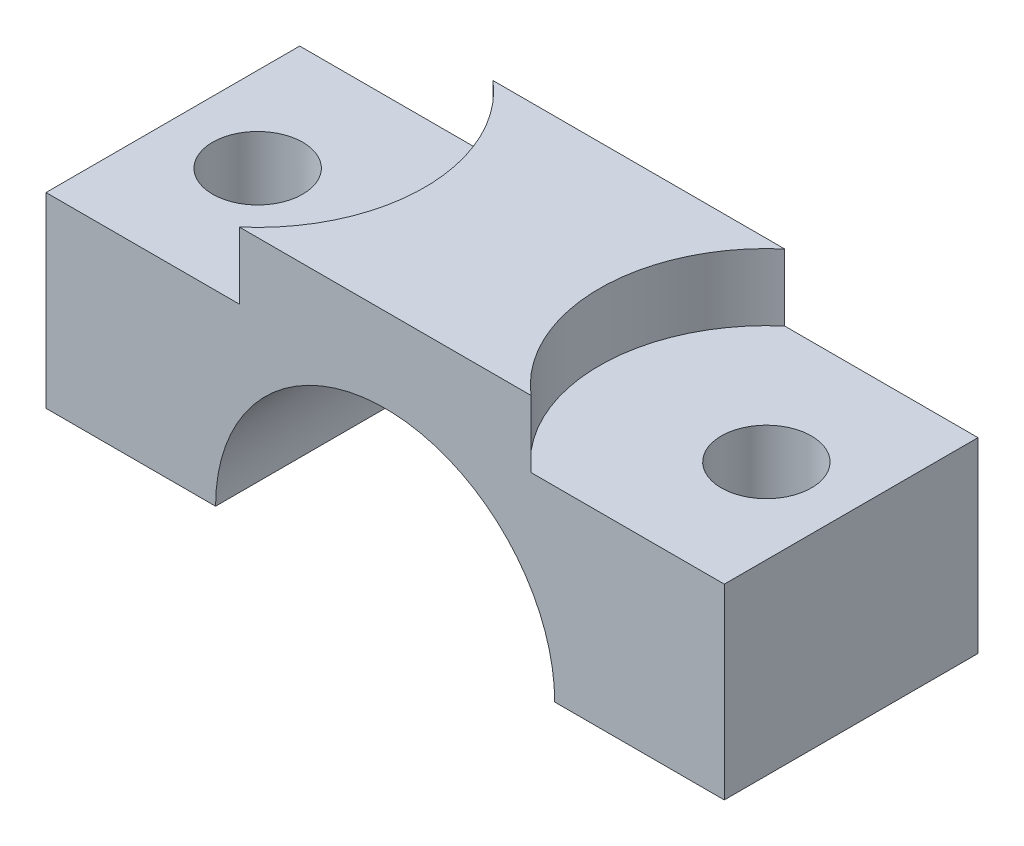
ISO-10303-21;
HEADER;
FILE_DESCRIPTION(('STEP AP214'),'2;1');
FILE_NAME('part.step','',(''),(''),'','','');
FILE_SCHEMA(('AUTOMOTIVE_DESIGN { 1 0 10303 214 1 1 1 1 }'));
ENDSEC;
DATA;
#1=APPLICATION_CONTEXT('core data for automotive mechanical design processes');
#2=APPLICATION_PROTOCOL_DEFINITION('international standard','automotive_design',2000,#1);
#3=PRODUCT_CONTEXT('',#1,'mechanical');
#4=PRODUCT('Part','Part','',(#3));
#5=PRODUCT_RELATED_PRODUCT_CATEGORY('part','',(#4));
#6=PRODUCT_DEFINITION_FORMATION('','',#4);
#7=PRODUCT_DEFINITION_CONTEXT('part definition',#1,'design');
#8=PRODUCT_DEFINITION('design','',#6,#7);
#9=PRODUCT_DEFINITION_SHAPE('','',#8);
#10=(LENGTH_UNIT() NAMED_UNIT(*) SI_UNIT(.MILLI.,.METRE.));
#11=(NAMED_UNIT(*) PLANE_ANGLE_UNIT() SI_UNIT($,.RADIAN.));
#12=(NAMED_UNIT(*) SI_UNIT($,.STERADIAN.) SOLID_ANGLE_UNIT());
#13=UNCERTAINTY_MEASURE_WITH_UNIT(LENGTH_MEASURE(1.E-05),#10,'distance_accuracy_value','');
#14=(GEOMETRIC_REPRESENTATION_CONTEXT(3) GLOBAL_UNCERTAINTY_ASSIGNED_CONTEXT((#13)) GLOBAL_UNIT_ASSIGNED_CONTEXT((#10,
#11,#12)) REPRESENTATION_CONTEXT('',''));
#15=CARTESIAN_POINT('',(0.,0.,0.));
#16=DIRECTION('',(0.,0.,1.));
#17=DIRECTION('',(1.,0.,0.));
#18=AXIS2_PLACEMENT_3D('',#15,#16,#17);
#19=CARTESIAN_POINT('',(0.,19.,9.5));
#20=DIRECTION('',(0.,1.,0.));
#21=DIRECTION('',(0.,0.,1.));
#22=AXIS2_PLACEMENT_3D('',#19,#20,#21);
#23=PLANE('',#22);
#24=CARTESIAN_POINT('',(19.05,19.,0.));
#25=DIRECTION('',(0.,1.,0.));
#26=DIRECTION('',(0.,0.,1.));
#27=AXIS2_PLACEMENT_3D('',#24,#25,#26);
#28=CIRCLE('',#27,12.5);
#29=CARTESIAN_POINT('',(10.925961595364,19.,-9.5));
#30=VERTEX_POINT('',#29);
#31=CARTESIAN_POINT('',(10.925961595364,19.,9.5));
#32=VERTEX_POINT('',#31);
#33=EDGE_CURVE('E151',#30,#32,#28,.T.);
#34=ORIENTED_EDGE('',*,*,#33,.F.);
#35=DIRECTION('',(1.,0.,0.));
#36=VECTOR('',#35,1.);
#37=CARTESIAN_POINT('',(0.,19.,-9.5));
#38=LINE('',#37,#36);
#39=CARTESIAN_POINT('',(-10.925961595364,19.,-9.5));
#40=VERTEX_POINT('',#39);
#41=EDGE_CURVE('E138',#40,#30,#38,.T.);
#42=ORIENTED_EDGE('',*,*,#41,.F.);
#43=CARTESIAN_POINT('',(-19.05,19.,0.));
#44=DIRECTION('',(0.,-1.,0.));
#45=DIRECTION('',(0.,0.,-1.));
#46=AXIS2_PLACEMENT_3D('',#43,#44,#45);
#47=CIRCLE('',#46,12.5);
#48=CARTESIAN_POINT('',(-10.925961595364,19.,9.5));
#49=VERTEX_POINT('',#48);
#50=EDGE_CURVE('E148',#40,#49,#47,.T.);
#51=ORIENTED_EDGE('',*,*,#50,.T.);
#52=DIRECTION('',(1.,0.,0.));
#53=VECTOR('',#52,1.);
#54=CARTESIAN_POINT('',(0.,19.,9.5));
#55=LINE('',#54,#53);
#56=EDGE_CURVE('E180',#49,#32,#55,.T.);
#57=ORIENTED_EDGE('',*,*,#56,.T.);
#58=EDGE_LOOP('',(#34,#42,#51,#57));
#59=FACE_BOUND('',#58,.T.);
#60=ADVANCED_FACE('F41',(#59),#23,.T.);
#61=CARTESIAN_POINT('',(25.4,0.,9.5));
#62=DIRECTION('',(-1.,0.,0.));
#63=DIRECTION('',(0.,0.,1.));
#64=AXIS2_PLACEMENT_3D('',#61,#62,#63);
#65=PLANE('',#64);
#66=DIRECTION('',(0.,0.,-1.));
#67=VECTOR('',#66,1.);
#68=CARTESIAN_POINT('',(25.4,14.,0.));
#69=LINE('',#68,#67);
#70=CARTESIAN_POINT('',(25.4,14.,9.5));
#71=VERTEX_POINT('',#70);
#72=CARTESIAN_POINT('',(25.4,14.,-9.5));
#73=VERTEX_POINT('',#72);
#74=EDGE_CURVE('E65',#71,#73,#69,.T.);
#75=ORIENTED_EDGE('',*,*,#74,.F.);
#76=DIRECTION('',(0.,1.,0.));
#77=VECTOR('',#76,1.);
#78=CARTESIAN_POINT('',(25.4,0.,9.5));
#79=LINE('',#78,#77);
#80=CARTESIAN_POINT('',(25.4,0.,9.5));
#81=VERTEX_POINT('',#80);
#82=EDGE_CURVE('E177',#81,#71,#79,.T.);
#83=ORIENTED_EDGE('',*,*,#82,.F.);
#84=DIRECTION('',(0.,0.,-1.));
#85=VECTOR('',#84,1.);
#86=CARTESIAN_POINT('',(25.4,0.,9.5));
#87=LINE('',#86,#85);
#88=CARTESIAN_POINT('',(25.4,0.,-9.5));
#89=VERTEX_POINT('',#88);
#90=EDGE_CURVE('E199',#81,#89,#87,.T.);
#91=ORIENTED_EDGE('',*,*,#90,.T.);
#92=DIRECTION('',(0.,1.,0.));
#93=VECTOR('',#92,1.);
#94=CARTESIAN_POINT('',(25.4,0.,-9.5));
#95=LINE('',#94,#93);
#96=EDGE_CURVE('E193',#89,#73,#95,.T.);
#97=ORIENTED_EDGE('',*,*,#96,.T.);
#98=EDGE_LOOP('',(#75,#83,#91,#97));
#99=FACE_BOUND('',#98,.T.);
#100=ADVANCED_FACE('F214',(#99),#65,.F.);
#101=CARTESIAN_POINT('',(0.,0.,9.5));
#102=DIRECTION('',(0.,0.,1.));
#103=DIRECTION('',(1.,0.,0.));
#104=AXIS2_PLACEMENT_3D('',#101,#102,#103);
#105=PLANE('',#104);
#106=DIRECTION('',(0.,1.,0.));
#107=VECTOR('',#106,1.);
#108=CARTESIAN_POINT('',(10.925961595364,14.,9.5));
#109=LINE('',#108,#107);
#110=CARTESIAN_POINT('',(10.925961595364,14.,9.5));
#111=VERTEX_POINT('',#110);
#112=EDGE_CURVE('E124',#111,#32,#109,.T.);
#113=ORIENTED_EDGE('',*,*,#112,.T.);
#114=ORIENTED_EDGE('',*,*,#56,.F.);
#115=DIRECTION('',(0.,1.,0.));
#116=VECTOR('',#115,1.);
#117=CARTESIAN_POINT('',(-10.925961595364,14.,9.5));
#118=LINE('',#117,#116);
#119=CARTESIAN_POINT('',(-10.925961595364,14.,9.5));
#120=VERTEX_POINT('',#119);
#121=EDGE_CURVE('E145',#120,#49,#118,.T.);
#122=ORIENTED_EDGE('',*,*,#121,.F.);
#123=DIRECTION('',(-1.,0.,0.));
#124=VECTOR('',#123,1.);
#125=CARTESIAN_POINT('',(-10.925961595364,14.,9.5));
#126=LINE('',#125,#124);
#127=CARTESIAN_POINT('',(-25.4,14.,9.5));
#128=VERTEX_POINT('',#127);
#129=EDGE_CURVE('E155',#120,#128,#126,.T.);
#130=ORIENTED_EDGE('',*,*,#129,.T.);
#131=DIRECTION('',(0.,1.,0.));
#132=VECTOR('',#131,1.);
#133=CARTESIAN_POINT('',(-25.4,0.,9.5));
#134=LINE('',#133,#132);
#135=CARTESIAN_POINT('',(-25.4,0.,9.5));
#136=VERTEX_POINT('',#135);
#137=EDGE_CURVE('E183',#136,#128,#134,.T.);
#138=ORIENTED_EDGE('',*,*,#137,.F.);
#139=DIRECTION('',(-1.,0.,0.));
#140=VECTOR('',#139,1.);
#141=CARTESIAN_POINT('',(0.,0.,9.5));
#142=LINE('',#141,#140);
#143=CARTESIAN_POINT('',(-12.7,0.,9.5));
#144=VERTEX_POINT('',#143);
#145=EDGE_CURVE('E169',#144,#136,#142,.T.);
#146=ORIENTED_EDGE('',*,*,#145,.F.);
#147=CARTESIAN_POINT('',(0.,0.,9.5));
#148=DIRECTION('',(0.,0.,1.));
#149=DIRECTION('',(1.,0.,0.));
#150=AXIS2_PLACEMENT_3D('',#147,#148,#149);
#151=CIRCLE('',#150,12.7);
#152=CARTESIAN_POINT('',(12.7,1.11258151511047E-13,9.5));
#153=VERTEX_POINT('',#152);
#154=EDGE_CURVE('E172',#144,#153,#151,.F.);
#155=ORIENTED_EDGE('',*,*,#154,.T.);
#156=DIRECTION('',(1.,0.,0.));
#157=VECTOR('',#156,1.);
#158=CARTESIAN_POINT('',(0.,0.,9.5));
#159=LINE('',#158,#157);
#160=EDGE_CURVE('E175',#153,#81,#159,.T.);
#161=ORIENTED_EDGE('',*,*,#160,.T.);
#162=ORIENTED_EDGE('',*,*,#82,.T.);
#163=DIRECTION('',(1.,0.,0.));
#164=VECTOR('',#163,1.);
#165=CARTESIAN_POINT('',(0.,14.,9.5));
#166=LINE('',#165,#164);
#167=EDGE_CURVE('E126',#111,#71,#166,.T.);
#168=ORIENTED_EDGE('',*,*,#167,.F.);
#169=EDGE_LOOP('',(#113,#114,#122,#130,#138,#146,#155,#161,#162,#168));
#170=FACE_BOUND('',#169,.T.);
#171=ADVANCED_FACE('F217',(#170),#105,.T.);
#172=CARTESIAN_POINT('',(0.,0.,-9.5));
#173=DIRECTION('',(0.,0.,1.));
#174=DIRECTION('',(1.,0.,0.));
#175=AXIS2_PLACEMENT_3D('',#172,#173,#174);
#176=PLANE('',#175);
#177=ORIENTED_EDGE('',*,*,#41,.T.);
#178=DIRECTION('',(0.,1.,0.));
#179=VECTOR('',#178,1.);
#180=CARTESIAN_POINT('',(10.925961595364,14.,-9.5));
#181=LINE('',#180,#179);
#182=CARTESIAN_POINT('',(10.925961595364,14.,-9.5));
#183=VERTEX_POINT('',#182);
#184=EDGE_CURVE('E121',#183,#30,#181,.T.);
#185=ORIENTED_EDGE('',*,*,#184,.F.);
#186=DIRECTION('',(-1.,0.,0.));
#187=VECTOR('',#186,1.);
#188=CARTESIAN_POINT('',(0.,14.,-9.5));
#189=LINE('',#188,#187);
#190=EDGE_CURVE('E127',#73,#183,#189,.T.);
#191=ORIENTED_EDGE('',*,*,#190,.F.);
#192=ORIENTED_EDGE('',*,*,#96,.F.);
#193=DIRECTION('',(1.,0.,0.));
#194=VECTOR('',#193,1.);
#195=CARTESIAN_POINT('',(0.,0.,-9.5));
#196=LINE('',#195,#194);
#197=CARTESIAN_POINT('',(12.7,1.11258151511047E-13,-9.5));
#198=VERTEX_POINT('',#197);
#199=EDGE_CURVE('E191',#198,#89,#196,.T.);
#200=ORIENTED_EDGE('',*,*,#199,.F.);
#201=CARTESIAN_POINT('',(0.,0.,-9.5));
#202=DIRECTION('',(0.,0.,1.));
#203=DIRECTION('',(1.,0.,0.));
#204=AXIS2_PLACEMENT_3D('',#201,#202,#203);
#205=CIRCLE('',#204,12.7);
#206=CARTESIAN_POINT('',(-12.7,0.,-9.5));
#207=VERTEX_POINT('',#206);
#208=EDGE_CURVE('E189',#207,#198,#205,.F.);
#209=ORIENTED_EDGE('',*,*,#208,.F.);
#210=DIRECTION('',(-1.,0.,0.));
#211=VECTOR('',#210,1.);
#212=CARTESIAN_POINT('',(0.,0.,-9.5));
#213=LINE('',#212,#211);
#214=CARTESIAN_POINT('',(-25.4,0.,-9.5));
#215=VERTEX_POINT('',#214);
#216=EDGE_CURVE('E165',#207,#215,#213,.T.);
#217=ORIENTED_EDGE('',*,*,#216,.T.);
#218=DIRECTION('',(0.,1.,0.));
#219=VECTOR('',#218,1.);
#220=CARTESIAN_POINT('',(-25.4,0.,-9.5));
#221=LINE('',#220,#219);
#222=CARTESIAN_POINT('',(-25.4,14.,-9.5));
#223=VERTEX_POINT('',#222);
#224=EDGE_CURVE('E173',#215,#223,#221,.T.);
#225=ORIENTED_EDGE('',*,*,#224,.T.);
#226=DIRECTION('',(1.,0.,0.));
#227=VECTOR('',#226,1.);
#228=CARTESIAN_POINT('',(-25.4,14.,-9.5));
#229=LINE('',#228,#227);
#230=CARTESIAN_POINT('',(-10.925961595364,14.,-9.5));
#231=VERTEX_POINT('',#230);
#232=EDGE_CURVE('E152',#223,#231,#229,.T.);
#233=ORIENTED_EDGE('',*,*,#232,.T.);
#234=DIRECTION('',(0.,1.,0.));
#235=VECTOR('',#234,1.);
#236=CARTESIAN_POINT('',(-10.925961595364,14.,-9.5));
#237=LINE('',#236,#235);
#238=EDGE_CURVE('E57',#231,#40,#237,.T.);
#239=ORIENTED_EDGE('',*,*,#238,.T.);
#240=EDGE_LOOP('',(#177,#185,#191,#192,#200,#209,#217,#225,#233,#239));
#241=FACE_BOUND('',#240,.T.);
#242=ADVANCED_FACE('F136',(#241),#176,.F.);
#243=CARTESIAN_POINT('',(19.05,0.,0.));
#244=DIRECTION('',(0.,1.,0.));
#245=DIRECTION('',(0.,0.,1.));
#246=AXIS2_PLACEMENT_3D('',#243,#244,#245);
#247=CYLINDRICAL_SURFACE('',#246,3.375);
#248=CARTESIAN_POINT('',(19.05,0.,0.));
#249=DIRECTION('',(0.,1.,0.));
#250=DIRECTION('',(0.,0.,1.));
#251=AXIS2_PLACEMENT_3D('',#248,#249,#250);
#252=CIRCLE('',#251,3.375);
#253=CARTESIAN_POINT('',(19.05,0.,3.375));
#254=VERTEX_POINT('',#253);
#255=EDGE_CURVE('E162',#254,#254,#252,.F.);
#256=ORIENTED_EDGE('',*,*,#255,.T.);
#257=EDGE_LOOP('',(#256));
#258=FACE_BOUND('',#257,.T.);
#259=CARTESIAN_POINT('',(19.05,14.,0.));
#260=DIRECTION('',(0.,1.,0.));
#261=DIRECTION('',(0.,0.,1.));
#262=AXIS2_PLACEMENT_3D('',#259,#260,#261);
#263=CIRCLE('',#262,3.375);
#264=CARTESIAN_POINT('',(19.05,14.,3.375));
#265=VERTEX_POINT('',#264);
#266=EDGE_CURVE('E133',#265,#265,#263,.F.);
#267=ORIENTED_EDGE('',*,*,#266,.F.);
#268=EDGE_LOOP('',(#267));
#269=FACE_BOUND('',#268,.T.);
#270=ADVANCED_FACE('F239',(#258,#269),#247,.F.);
#271=CARTESIAN_POINT('',(0.,0.,9.5));
#272=DIRECTION('',(0.,-1.,0.));
#273=DIRECTION('',(1.,0.,0.));
#274=AXIS2_PLACEMENT_3D('',#271,#272,#273);
#275=PLANE('',#274);
#276=CARTESIAN_POINT('',(-19.05,0.,0.));
#277=DIRECTION('',(0.,1.,0.));
#278=DIRECTION('',(0.,0.,1.));
#279=AXIS2_PLACEMENT_3D('',#276,#277,#278);
#280=CIRCLE('',#279,3.375);
#281=CARTESIAN_POINT('',(-19.05,0.,3.375));
#282=VERTEX_POINT('',#281);
#283=EDGE_CURVE('E166',#282,#282,#280,.T.);
#284=ORIENTED_EDGE('',*,*,#283,.T.);
#285=EDGE_LOOP('',(#284));
#286=FACE_BOUND('',#285,.T.);
#287=ORIENTED_EDGE('',*,*,#216,.F.);
#288=DIRECTION('',(0.,0.,-1.));
#289=VECTOR('',#288,1.);
#290=CARTESIAN_POINT('',(-12.7,0.,9.5));
#291=LINE('',#290,#289);
#292=EDGE_CURVE('E11',#144,#207,#291,.T.);
#293=ORIENTED_EDGE('',*,*,#292,.F.);
#294=ORIENTED_EDGE('',*,*,#145,.T.);
#295=DIRECTION('',(0.,0.,-1.));
#296=VECTOR('',#295,1.);
#297=CARTESIAN_POINT('',(-25.4,0.,9.5));
#298=LINE('',#297,#296);
#299=EDGE_CURVE('E186',#136,#215,#298,.T.);
#300=ORIENTED_EDGE('',*,*,#299,.T.);
#301=EDGE_LOOP('',(#287,#293,#294,#300));
#302=FACE_BOUND('',#301,.T.);
#303=ADVANCED_FACE('F43',(#286,#302),#275,.T.);
#304=CARTESIAN_POINT('',(0.,0.,9.5));
#305=DIRECTION('',(0.,0.,-1.));
#306=DIRECTION('',(-1.,0.,0.));
#307=AXIS2_PLACEMENT_3D('',#304,#305,#306);
#308=CYLINDRICAL_SURFACE('',#307,12.7);
#309=ORIENTED_EDGE('',*,*,#208,.T.);
#310=DIRECTION('',(0.,0.,-1.));
#311=VECTOR('',#310,1.);
#312=CARTESIAN_POINT('',(12.7,1.11258151511047E-13,9.5));
#313=LINE('',#312,#311);
#314=EDGE_CURVE('E50',#153,#198,#313,.T.);
#315=ORIENTED_EDGE('',*,*,#314,.F.);
#316=ORIENTED_EDGE('',*,*,#154,.F.);
#317=ORIENTED_EDGE('',*,*,#292,.T.);
#318=EDGE_LOOP('',(#309,#315,#316,#317));
#319=FACE_BOUND('',#318,.T.);
#320=ADVANCED_FACE('F220',(#319),#308,.F.);
#321=CARTESIAN_POINT('',(0.,0.,9.5));
#322=DIRECTION('',(0.,1.,0.));
#323=DIRECTION('',(-1.,0.,0.));
#324=AXIS2_PLACEMENT_3D('',#321,#322,#323);
#325=PLANE('',#324);
#326=ORIENTED_EDGE('',*,*,#255,.F.);
#327=EDGE_LOOP('',(#326));
#328=FACE_BOUND('',#327,.T.);
#329=ORIENTED_EDGE('',*,*,#199,.T.);
#330=ORIENTED_EDGE('',*,*,#90,.F.);
#331=ORIENTED_EDGE('',*,*,#160,.F.);
#332=ORIENTED_EDGE('',*,*,#314,.T.);
#333=EDGE_LOOP('',(#329,#330,#331,#332));
#334=FACE_BOUND('',#333,.T.);
#335=ADVANCED_FACE('F207',(#328,#334),#325,.F.);
#336=CARTESIAN_POINT('',(-25.4,0.,9.5));
#337=DIRECTION('',(-1.,0.,0.));
#338=DIRECTION('',(0.,0.,1.));
#339=AXIS2_PLACEMENT_3D('',#336,#337,#338);
#340=PLANE('',#339);
#341=DIRECTION('',(0.,0.,-1.));
#342=VECTOR('',#341,1.);
#343=CARTESIAN_POINT('',(-25.4,14.,9.5));
#344=LINE('',#343,#342);
#345=EDGE_CURVE('E147',#128,#223,#344,.T.);
#346=ORIENTED_EDGE('',*,*,#345,.T.);
#347=ORIENTED_EDGE('',*,*,#224,.F.);
#348=ORIENTED_EDGE('',*,*,#299,.F.);
#349=ORIENTED_EDGE('',*,*,#137,.T.);
#350=EDGE_LOOP('',(#346,#347,#348,#349));
#351=FACE_BOUND('',#350,.T.);
#352=ADVANCED_FACE('F224',(#351),#340,.T.);
#353=CARTESIAN_POINT('',(-19.05,0.,0.));
#354=DIRECTION('',(0.,1.,0.));
#355=DIRECTION('',(0.,0.,1.));
#356=AXIS2_PLACEMENT_3D('',#353,#354,#355);
#357=CYLINDRICAL_SURFACE('',#356,3.375);
#358=CARTESIAN_POINT('',(-19.05,14.,0.));
#359=DIRECTION('',(0.,-1.,0.));
#360=DIRECTION('',(0.,0.,-1.));
#361=AXIS2_PLACEMENT_3D('',#358,#359,#360);
#362=CIRCLE('',#361,3.375);
#363=CARTESIAN_POINT('',(-19.05,14.,-3.375));
#364=VERTEX_POINT('',#363);
#365=EDGE_CURVE('E45',#364,#364,#362,.F.);
#366=ORIENTED_EDGE('',*,*,#365,.T.);
#367=EDGE_LOOP('',(#366));
#368=FACE_BOUND('',#367,.T.);
#369=ORIENTED_EDGE('',*,*,#283,.F.);
#370=EDGE_LOOP('',(#369));
#371=FACE_BOUND('',#370,.T.);
#372=ADVANCED_FACE('F276',(#368,#371),#357,.F.);
#373=CARTESIAN_POINT('',(19.05,14.,0.));
#374=DIRECTION('',(0.,1.,0.));
#375=DIRECTION('',(0.,0.,1.));
#376=AXIS2_PLACEMENT_3D('',#373,#374,#375);
#377=CYLINDRICAL_SURFACE('',#376,12.5);
#378=ORIENTED_EDGE('',*,*,#33,.T.);
#379=ORIENTED_EDGE('',*,*,#112,.F.);
#380=CARTESIAN_POINT('',(19.05,14.,0.));
#381=DIRECTION('',(0.,1.,0.));
#382=DIRECTION('',(0.,0.,1.));
#383=AXIS2_PLACEMENT_3D('',#380,#381,#382);
#384=CIRCLE('',#383,12.5);
#385=EDGE_CURVE('E118',#183,#111,#384,.T.);
#386=ORIENTED_EDGE('',*,*,#385,.F.);
#387=ORIENTED_EDGE('',*,*,#184,.T.);
#388=EDGE_LOOP('',(#378,#379,#386,#387));
#389=FACE_BOUND('',#388,.T.);
#390=ADVANCED_FACE('F119',(#389),#377,.F.);
#391=CARTESIAN_POINT('',(0.,14.,0.));
#392=DIRECTION('',(0.,1.,0.));
#393=DIRECTION('',(0.,0.,1.));
#394=AXIS2_PLACEMENT_3D('',#391,#392,#393);
#395=PLANE('',#394);
#396=ORIENTED_EDGE('',*,*,#266,.T.);
#397=EDGE_LOOP('',(#396));
#398=FACE_BOUND('',#397,.T.);
#399=ORIENTED_EDGE('',*,*,#190,.T.);
#400=ORIENTED_EDGE('',*,*,#385,.T.);
#401=ORIENTED_EDGE('',*,*,#167,.T.);
#402=ORIENTED_EDGE('',*,*,#74,.T.);
#403=EDGE_LOOP('',(#399,#400,#401,#402));
#404=FACE_BOUND('',#403,.T.);
#405=ADVANCED_FACE('F129',(#398,#404),#395,.T.);
#406=CARTESIAN_POINT('',(-19.05,14.,0.));
#407=DIRECTION('',(0.,-1.,0.));
#408=DIRECTION('',(0.,0.,-1.));
#409=AXIS2_PLACEMENT_3D('',#406,#407,#408);
#410=PLANE('',#409);
#411=ORIENTED_EDGE('',*,*,#232,.F.);
#412=ORIENTED_EDGE('',*,*,#345,.F.);
#413=ORIENTED_EDGE('',*,*,#129,.F.);
#414=CARTESIAN_POINT('',(-19.05,14.,0.));
#415=DIRECTION('',(0.,-1.,0.));
#416=DIRECTION('',(0.,0.,-1.));
#417=AXIS2_PLACEMENT_3D('',#414,#415,#416);
#418=CIRCLE('',#417,12.5);
#419=EDGE_CURVE('E158',#231,#120,#418,.T.);
#420=ORIENTED_EDGE('',*,*,#419,.F.);
#421=EDGE_LOOP('',(#411,#412,#413,#420));
#422=FACE_BOUND('',#421,.T.);
#423=ORIENTED_EDGE('',*,*,#365,.F.);
#424=EDGE_LOOP('',(#423));
#425=FACE_BOUND('',#424,.T.);
#426=ADVANCED_FACE('F227',(#422,#425),#410,.F.);
#427=CARTESIAN_POINT('',(-19.05,14.,0.));
#428=DIRECTION('',(0.,1.,0.));
#429=DIRECTION('',(0.,0.,1.));
#430=AXIS2_PLACEMENT_3D('',#427,#428,#429);
#431=CYLINDRICAL_SURFACE('',#430,12.5);
#432=ORIENTED_EDGE('',*,*,#50,.F.);
#433=ORIENTED_EDGE('',*,*,#238,.F.);
#434=ORIENTED_EDGE('',*,*,#419,.T.);
#435=ORIENTED_EDGE('',*,*,#121,.T.);
#436=EDGE_LOOP('',(#432,#433,#434,#435));
#437=FACE_BOUND('',#436,.T.);
#438=ADVANCED_FACE('F231',(#437),#431,.F.);
#439=CLOSED_SHELL('',(#60,#100,#171,#242,#270,#303,#320,#335,#352,#372,#390,#405,#426,#438));
#440=MANIFOLD_SOLID_BREP('B2',#439);
#441=ADVANCED_BREP_SHAPE_REPRESENTATION('',(#18,#440),#14);
#442=SHAPE_DEFINITION_REPRESENTATION(#9,#441);
ENDSEC;
END-ISO-10303-21;
